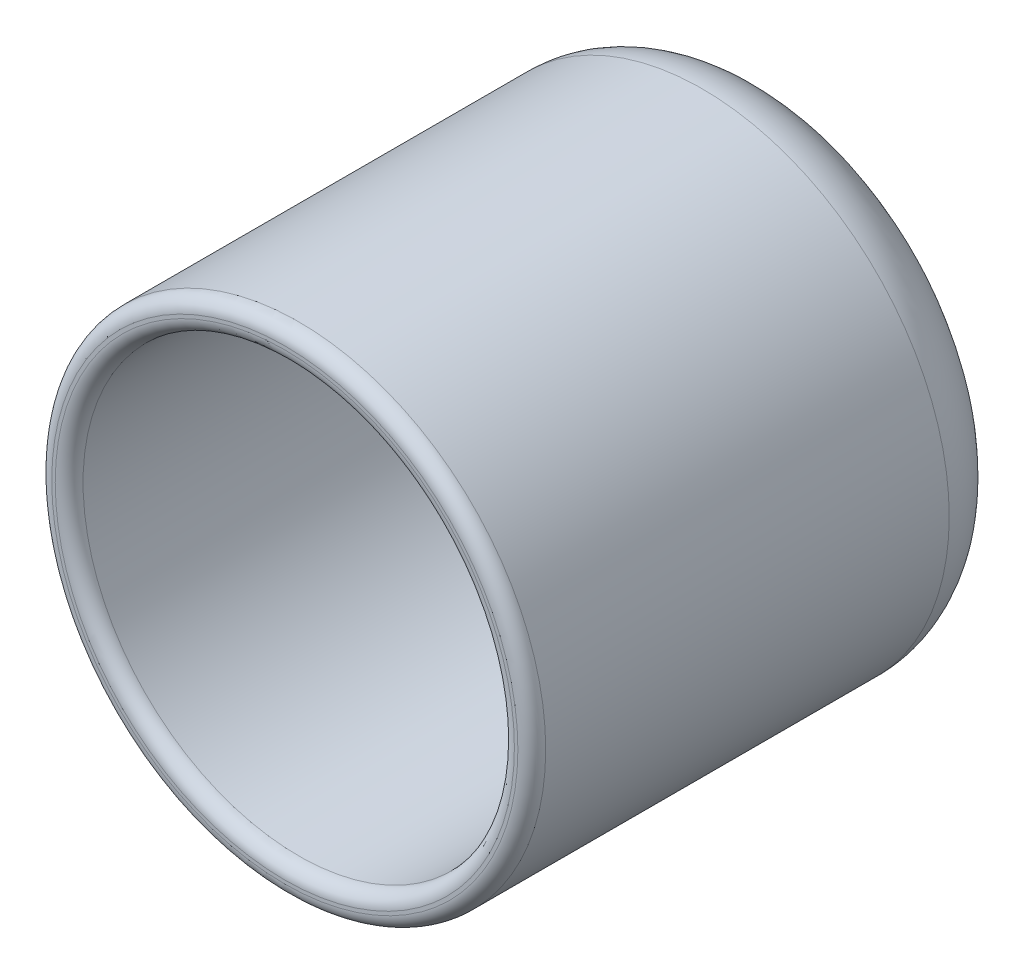
ISO-10303-21;
HEADER;
FILE_DESCRIPTION(('STEP AP214'),'2;1');
FILE_NAME('part.step','',(''),(''),'','','');
FILE_SCHEMA(('AUTOMOTIVE_DESIGN { 1 0 10303 214 1 1 1 1 }'));
ENDSEC;
DATA;
#1=APPLICATION_CONTEXT('core data for automotive mechanical design processes');
#2=APPLICATION_PROTOCOL_DEFINITION('international standard','automotive_design',2000,#1);
#3=PRODUCT_CONTEXT('',#1,'mechanical');
#4=PRODUCT('Part','Part','',(#3));
#5=PRODUCT_RELATED_PRODUCT_CATEGORY('part','',(#4));
#6=PRODUCT_DEFINITION_FORMATION('','',#4);
#7=PRODUCT_DEFINITION_CONTEXT('part definition',#1,'design');
#8=PRODUCT_DEFINITION('design','',#6,#7);
#9=PRODUCT_DEFINITION_SHAPE('','',#8);
#10=(LENGTH_UNIT() NAMED_UNIT(*) SI_UNIT(.MILLI.,.METRE.));
#11=(NAMED_UNIT(*) PLANE_ANGLE_UNIT() SI_UNIT($,.RADIAN.));
#12=(NAMED_UNIT(*) SI_UNIT($,.STERADIAN.) SOLID_ANGLE_UNIT());
#13=UNCERTAINTY_MEASURE_WITH_UNIT(LENGTH_MEASURE(1.E-05),#10,'distance_accuracy_value','');
#14=(GEOMETRIC_REPRESENTATION_CONTEXT(3) GLOBAL_UNCERTAINTY_ASSIGNED_CONTEXT((#13)) GLOBAL_UNIT_ASSIGNED_CONTEXT((#10,
#11,#12)) REPRESENTATION_CONTEXT('',''));
#15=CARTESIAN_POINT('',(0.,0.,0.));
#16=DIRECTION('',(0.,0.,1.));
#17=DIRECTION('',(1.,0.,0.));
#18=AXIS2_PLACEMENT_3D('',#15,#16,#17);
#19=CARTESIAN_POINT('',(0.,0.,7.));
#20=DIRECTION('',(0.,0.,-1.));
#21=DIRECTION('',(-1.,0.,0.));
#22=AXIS2_PLACEMENT_3D('',#19,#20,#21);
#23=CYLINDRICAL_SURFACE('',#22,3.55);
#24=CARTESIAN_POINT('',(0.,0.,1.));
#25=DIRECTION('',(0.,0.,1.));
#26=DIRECTION('',(1.,0.,0.));
#27=AXIS2_PLACEMENT_3D('',#24,#25,#26);
#28=CIRCLE('',#27,3.55);
#29=CARTESIAN_POINT('',(3.55,0.,1.));
#30=VERTEX_POINT('',#29);
#31=EDGE_CURVE('E38',#30,#30,#28,.T.);
#32=ORIENTED_EDGE('',*,*,#31,.T.);
#33=EDGE_LOOP('',(#32));
#34=FACE_BOUND('',#33,.T.);
#35=CARTESIAN_POINT('',(0.,0.,6.8));
#36=DIRECTION('',(0.,0.,1.));
#37=DIRECTION('',(1.,0.,0.));
#38=AXIS2_PLACEMENT_3D('',#35,#36,#37);
#39=CIRCLE('',#38,3.55);
#40=CARTESIAN_POINT('',(3.55,0.,6.8));
#41=VERTEX_POINT('',#40);
#42=EDGE_CURVE('E42',#41,#41,#39,.F.);
#43=ORIENTED_EDGE('',*,*,#42,.T.);
#44=EDGE_LOOP('',(#43));
#45=FACE_BOUND('',#44,.T.);
#46=ADVANCED_FACE('F31',(#34,#45),#23,.T.);
#47=CARTESIAN_POINT('',(0.,0.,7.));
#48=DIRECTION('',(0.,0.,1.));
#49=DIRECTION('',(1.,0.,0.));
#50=AXIS2_PLACEMENT_3D('',#47,#48,#49);
#51=PLANE('',#50);
#52=CARTESIAN_POINT('',(0.,0.,7.));
#53=DIRECTION('',(0.,0.,1.));
#54=DIRECTION('',(1.,0.,0.));
#55=AXIS2_PLACEMENT_3D('',#52,#53,#54);
#56=CIRCLE('',#55,3.3);
#57=CARTESIAN_POINT('',(3.3,0.,7.));
#58=VERTEX_POINT('',#57);
#59=EDGE_CURVE('E46',#58,#58,#56,.F.);
#60=ORIENTED_EDGE('',*,*,#59,.T.);
#61=EDGE_LOOP('',(#60));
#62=FACE_BOUND('',#61,.T.);
#63=CARTESIAN_POINT('',(0.,0.,7.));
#64=DIRECTION('',(0.,0.,1.));
#65=DIRECTION('',(1.,0.,0.));
#66=AXIS2_PLACEMENT_3D('',#63,#64,#65);
#67=CIRCLE('',#66,3.35);
#68=CARTESIAN_POINT('',(3.35,0.,7.));
#69=VERTEX_POINT('',#68);
#70=EDGE_CURVE('E51',#69,#69,#67,.T.);
#71=ORIENTED_EDGE('',*,*,#70,.T.);
#72=EDGE_LOOP('',(#71));
#73=FACE_BOUND('',#72,.T.);
#74=ADVANCED_FACE('F74',(#62,#73),#51,.T.);
#75=CARTESIAN_POINT('',(0.,0.,0.));
#76=DIRECTION('',(0.,0.,1.));
#77=DIRECTION('',(1.,0.,0.));
#78=AXIS2_PLACEMENT_3D('',#75,#76,#77);
#79=PLANE('',#78);
#80=CARTESIAN_POINT('',(0.,0.,0.));
#81=DIRECTION('',(0.,0.,1.));
#82=DIRECTION('',(1.,0.,0.));
#83=AXIS2_PLACEMENT_3D('',#80,#81,#82);
#84=CIRCLE('',#83,2.55);
#85=CARTESIAN_POINT('',(2.55,0.,0.));
#86=VERTEX_POINT('',#85);
#87=EDGE_CURVE('E10',#86,#86,#84,.F.);
#88=ORIENTED_EDGE('',*,*,#87,.T.);
#89=EDGE_LOOP('',(#88));
#90=FACE_BOUND('',#89,.T.);
#91=ADVANCED_FACE('F65',(#90),#79,.F.);
#92=CARTESIAN_POINT('',(0.,0.,0.5));
#93=DIRECTION('',(0.,0.,1.));
#94=DIRECTION('',(1.,0.,0.));
#95=AXIS2_PLACEMENT_3D('',#92,#93,#94);
#96=CYLINDRICAL_SURFACE('',#95,3.1);
#97=CARTESIAN_POINT('',(0.,0.,6.8));
#98=DIRECTION('',(0.,0.,1.));
#99=DIRECTION('',(1.,0.,0.));
#100=AXIS2_PLACEMENT_3D('',#97,#98,#99);
#101=CIRCLE('',#100,3.1);
#102=CARTESIAN_POINT('',(3.1,0.,6.8));
#103=VERTEX_POINT('',#102);
#104=EDGE_CURVE('E54',#103,#103,#101,.T.);
#105=CARTESIAN_POINT('',(0.,0.,0.5));
#106=DIRECTION('',(0.,0.,1.));
#107=DIRECTION('',(1.,0.,0.));
#108=AXIS2_PLACEMENT_3D('',#105,#106,#107);
#109=CIRCLE('',#108,3.1);
#110=CARTESIAN_POINT('',(3.1,0.,0.5));
#111=VERTEX_POINT('',#110);
#112=EDGE_CURVE('E57',#111,#111,#109,.T.);
#113=CARTESIAN_POINT('',(3.1,0.,6.8));
#114=CARTESIAN_POINT('',(3.1,0.,6.734375));
#115=CARTESIAN_POINT('',(3.1,0.,6.66875));
#116=CARTESIAN_POINT('',(3.1,0.,6.5375));
#117=CARTESIAN_POINT('',(3.1,0.,6.471875));
#118=CARTESIAN_POINT('',(3.1,0.,6.340625));
#119=CARTESIAN_POINT('',(3.1,0.,6.275));
#120=CARTESIAN_POINT('',(3.1,0.,6.14375));
#121=CARTESIAN_POINT('',(3.1,0.,6.078125));
#122=CARTESIAN_POINT('',(3.1,0.,5.946875));
#123=CARTESIAN_POINT('',(3.1,0.,5.88125));
#124=CARTESIAN_POINT('',(3.1,0.,5.75));
#125=CARTESIAN_POINT('',(3.1,0.,5.684375));
#126=CARTESIAN_POINT('',(3.1,0.,5.553125));
#127=CARTESIAN_POINT('',(3.1,0.,5.4875));
#128=CARTESIAN_POINT('',(3.1,0.,5.35625));
#129=CARTESIAN_POINT('',(3.1,0.,5.290625));
#130=CARTESIAN_POINT('',(3.1,0.,5.159375));
#131=CARTESIAN_POINT('',(3.1,0.,5.09375));
#132=CARTESIAN_POINT('',(3.1,0.,4.9625));
#133=CARTESIAN_POINT('',(3.1,0.,4.896875));
#134=CARTESIAN_POINT('',(3.1,0.,4.765625));
#135=CARTESIAN_POINT('',(3.1,0.,4.7));
#136=CARTESIAN_POINT('',(3.1,0.,4.56875));
#137=CARTESIAN_POINT('',(3.1,0.,4.503125));
#138=CARTESIAN_POINT('',(3.1,0.,4.371875));
#139=CARTESIAN_POINT('',(3.1,0.,4.30625));
#140=CARTESIAN_POINT('',(3.1,0.,4.175));
#141=CARTESIAN_POINT('',(3.1,0.,4.109375));
#142=CARTESIAN_POINT('',(3.1,0.,3.978125));
#143=CARTESIAN_POINT('',(3.1,0.,3.9125));
#144=CARTESIAN_POINT('',(3.1,0.,3.78125));
#145=CARTESIAN_POINT('',(3.1,0.,3.715625));
#146=CARTESIAN_POINT('',(3.1,0.,3.584375));
#147=CARTESIAN_POINT('',(3.1,0.,3.51875));
#148=CARTESIAN_POINT('',(3.1,0.,3.3875));
#149=CARTESIAN_POINT('',(3.1,0.,3.321875));
#150=CARTESIAN_POINT('',(3.1,0.,3.190625));
#151=CARTESIAN_POINT('',(3.1,0.,3.125));
#152=CARTESIAN_POINT('',(3.1,0.,2.99375));
#153=CARTESIAN_POINT('',(3.1,0.,2.928125));
#154=CARTESIAN_POINT('',(3.1,0.,2.796875));
#155=CARTESIAN_POINT('',(3.1,0.,2.73125));
#156=CARTESIAN_POINT('',(3.1,0.,2.6));
#157=CARTESIAN_POINT('',(3.1,0.,2.534375));
#158=CARTESIAN_POINT('',(3.1,0.,2.403125));
#159=CARTESIAN_POINT('',(3.1,0.,2.3375));
#160=CARTESIAN_POINT('',(3.1,0.,2.20625));
#161=CARTESIAN_POINT('',(3.1,0.,2.140625));
#162=CARTESIAN_POINT('',(3.1,0.,2.009375));
#163=CARTESIAN_POINT('',(3.1,0.,1.94375));
#164=CARTESIAN_POINT('',(3.1,0.,1.8125));
#165=CARTESIAN_POINT('',(3.1,0.,1.746875));
#166=CARTESIAN_POINT('',(3.1,0.,1.615625));
#167=CARTESIAN_POINT('',(3.1,0.,1.55));
#168=CARTESIAN_POINT('',(3.1,0.,1.41875));
#169=CARTESIAN_POINT('',(3.1,0.,1.353125));
#170=CARTESIAN_POINT('',(3.1,0.,1.221875));
#171=CARTESIAN_POINT('',(3.1,0.,1.15625));
#172=CARTESIAN_POINT('',(3.1,0.,1.025));
#173=CARTESIAN_POINT('',(3.1,0.,0.959375000000001));
#174=CARTESIAN_POINT('',(3.1,0.,0.828125));
#175=CARTESIAN_POINT('',(3.1,0.,0.762500000000001));
#176=CARTESIAN_POINT('',(3.1,0.,0.63125));
#177=CARTESIAN_POINT('',(3.1,0.,0.565625));
#178=CARTESIAN_POINT('',(3.1,0.,0.5));
#179=B_SPLINE_CURVE_WITH_KNOTS('',3,(#113,#114,#115,#116,#117,#118,#119,#120,#121,#122,#123,
#124,#125,#126,#127,#128,#129,#130,#131,#132,#133,#134,#135,#136,#137,#138,#139,#140,#141,#142,
#143,#144,#145,#146,#147,#148,#149,#150,#151,#152,#153,#154,#155,#156,#157,#158,#159,#160,#161,
#162,#163,#164,#165,#166,#167,#168,#169,#170,#171,#172,#173,#174,#175,#176,#177,#178),
.UNSPECIFIED.,.F.,.F.,(4,2,2,2,2,2,2,2,2,2,2,2,2,2,2,2,2,2,2,2,2,2,2,2,2,2,2,2,2,2,2,2,4),(0.,
0.196875,0.39375,0.590625,0.7875,0.984375,1.18125,1.378125,1.575,1.771875,1.96875,2.165625,
2.3625,2.559375,2.75625,2.953125,3.15,3.346875,3.54375,3.740625,3.9375,4.134375,4.33125,
4.528125,4.725,4.921875,5.11875,5.315625,5.5125,5.709375,5.90625,6.103125,6.3),.UNSPECIFIED.);
#180=EDGE_CURVE('BSEAM63',#103,#111,#179,.T.);
#181=ORIENTED_EDGE('',*,*,#104,.T.);
#182=ORIENTED_EDGE('',*,*,#112,.F.);
#183=ORIENTED_EDGE('',*,*,#180,.T.);
#184=ORIENTED_EDGE('',*,*,#180,.F.);
#185=EDGE_LOOP('',(#181,#183,#182,#184));
#186=FACE_BOUND('',#185,.T.);
#187=ADVANCED_FACE('F63',(#186),#96,.F.);
#188=CARTESIAN_POINT('',(0.,0.,0.5));
#189=DIRECTION('',(0.,0.,1.));
#190=DIRECTION('',(1.,0.,0.));
#191=AXIS2_PLACEMENT_3D('',#188,#189,#190);
#192=PLANE('',#191);
#193=ORIENTED_EDGE('',*,*,#112,.T.);
#194=EDGE_LOOP('',(#193));
#195=FACE_BOUND('',#194,.T.);
#196=ADVANCED_FACE('F61',(#195),#192,.T.);
#197=CARTESIAN_POINT('',(0.,0.,6.8));
#198=DIRECTION('',(0.,0.,1.));
#199=DIRECTION('',(1.,0.,0.));
#200=AXIS2_PLACEMENT_3D('',#197,#198,#199);
#201=TOROIDAL_SURFACE('',#200,3.3,0.2);
#202=ORIENTED_EDGE('',*,*,#59,.F.);
#203=EDGE_LOOP('',(#202));
#204=FACE_BOUND('',#203,.T.);
#205=ORIENTED_EDGE('',*,*,#104,.F.);
#206=EDGE_LOOP('',(#205));
#207=FACE_BOUND('',#206,.T.);
#208=ADVANCED_FACE('F72',(#204,#207),#201,.T.);
#209=CARTESIAN_POINT('',(0.,0.,6.8));
#210=DIRECTION('',(0.,0.,1.));
#211=DIRECTION('',(1.,0.,0.));
#212=AXIS2_PLACEMENT_3D('',#209,#210,#211);
#213=TOROIDAL_SURFACE('',#212,3.35,0.2);
#214=ORIENTED_EDGE('',*,*,#42,.F.);
#215=EDGE_LOOP('',(#214));
#216=FACE_BOUND('',#215,.T.);
#217=ORIENTED_EDGE('',*,*,#70,.F.);
#218=EDGE_LOOP('',(#217));
#219=FACE_BOUND('',#218,.T.);
#220=ADVANCED_FACE('F86',(#216,#219),#213,.T.);
#221=CARTESIAN_POINT('',(0.,0.,1.));
#222=DIRECTION('',(0.,0.,1.));
#223=DIRECTION('',(1.,0.,0.));
#224=AXIS2_PLACEMENT_3D('',#221,#222,#223);
#225=TOROIDAL_SURFACE('',#224,2.55,1.);
#226=ORIENTED_EDGE('',*,*,#87,.F.);
#227=EDGE_LOOP('',(#226));
#228=FACE_BOUND('',#227,.T.);
#229=ORIENTED_EDGE('',*,*,#31,.F.);
#230=EDGE_LOOP('',(#229));
#231=FACE_BOUND('',#230,.T.);
#232=ADVANCED_FACE('F33',(#228,#231),#225,.T.);
#233=CLOSED_SHELL('',(#46,#74,#91,#187,#196,#208,#220,#232));
#234=MANIFOLD_SOLID_BREP('B2',#233);
#235=ADVANCED_BREP_SHAPE_REPRESENTATION('',(#18,#234),#14);
#236=SHAPE_DEFINITION_REPRESENTATION(#9,#235);
ENDSEC;
END-ISO-10303-21;
